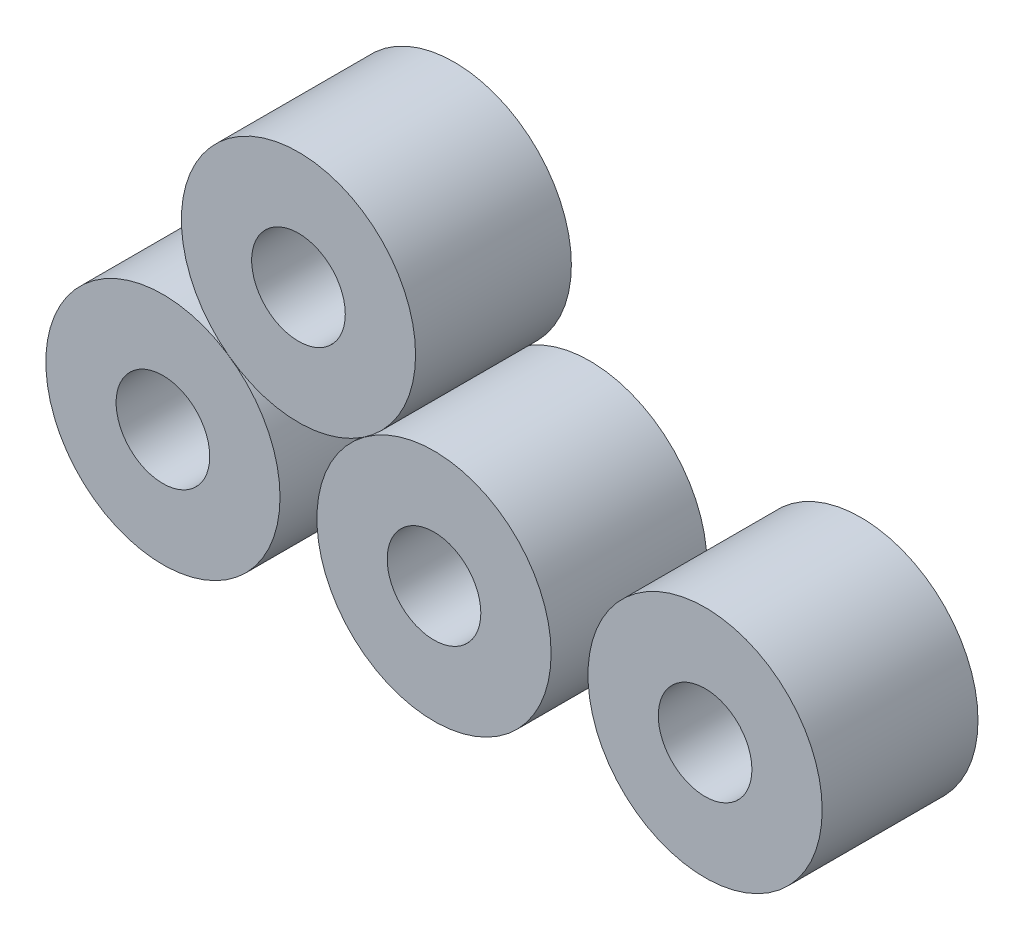
ISO-10303-21;
HEADER;
FILE_DESCRIPTION(('STEP AP214'),'2;1');
FILE_NAME('part.step','',(''),(''),'','','');
FILE_SCHEMA(('AUTOMOTIVE_DESIGN { 1 0 10303 214 1 1 1 1 }'));
ENDSEC;
DATA;
#1=APPLICATION_CONTEXT('core data for automotive mechanical design processes');
#2=APPLICATION_PROTOCOL_DEFINITION('international standard','automotive_design',2000,#1);
#3=PRODUCT_CONTEXT('',#1,'mechanical');
#4=PRODUCT('Part','Part','',(#3));
#5=PRODUCT_RELATED_PRODUCT_CATEGORY('part','',(#4));
#6=PRODUCT_DEFINITION_FORMATION('','',#4);
#7=PRODUCT_DEFINITION_CONTEXT('part definition',#1,'design');
#8=PRODUCT_DEFINITION('design','',#6,#7);
#9=PRODUCT_DEFINITION_SHAPE('','',#8);
#10=(LENGTH_UNIT() NAMED_UNIT(*) SI_UNIT(.MILLI.,.METRE.));
#11=(NAMED_UNIT(*) PLANE_ANGLE_UNIT() SI_UNIT($,.RADIAN.));
#12=(NAMED_UNIT(*) SI_UNIT($,.STERADIAN.) SOLID_ANGLE_UNIT());
#13=UNCERTAINTY_MEASURE_WITH_UNIT(LENGTH_MEASURE(1.E-05),#10,'distance_accuracy_value','');
#14=(GEOMETRIC_REPRESENTATION_CONTEXT(3) GLOBAL_UNCERTAINTY_ASSIGNED_CONTEXT((#13)) GLOBAL_UNIT_ASSIGNED_CONTEXT((#10,
#11,#12)) REPRESENTATION_CONTEXT('',''));
#15=CARTESIAN_POINT('',(0.,0.,0.));
#16=DIRECTION('',(0.,0.,1.));
#17=DIRECTION('',(1.,0.,0.));
#18=AXIS2_PLACEMENT_3D('',#15,#16,#17);
#19=CARTESIAN_POINT('',(0.,0.,1268.));
#20=DIRECTION('',(0.,0.,1.));
#21=DIRECTION('',(1.,0.,0.));
#22=AXIS2_PLACEMENT_3D('',#19,#20,#21);
#23=PLANE('',#22);
#24=CARTESIAN_POINT('',(0.,0.,1268.));
#25=DIRECTION('',(0.,0.,1.));
#26=DIRECTION('',(1.,0.,0.));
#27=AXIS2_PLACEMENT_3D('',#24,#25,#26);
#28=CIRCLE('',#27,953.);
#29=CARTESIAN_POINT('',(953.,0.,1268.));
#30=VERTEX_POINT('',#29);
#31=EDGE_CURVE('E97',#30,#30,#28,.T.);
#32=ORIENTED_EDGE('',*,*,#31,.T.);
#33=EDGE_LOOP('',(#32));
#34=FACE_BOUND('',#33,.T.);
#35=CARTESIAN_POINT('',(0.,0.,1268.));
#36=DIRECTION('',(0.,0.,1.));
#37=DIRECTION('',(1.,0.,0.));
#38=AXIS2_PLACEMENT_3D('',#35,#36,#37);
#39=CIRCLE('',#38,381.);
#40=CARTESIAN_POINT('',(381.,0.,1268.));
#41=VERTEX_POINT('',#40);
#42=EDGE_CURVE('E88',#41,#41,#39,.T.);
#43=ORIENTED_EDGE('',*,*,#42,.F.);
#44=EDGE_LOOP('',(#43));
#45=FACE_BOUND('',#44,.T.);
#46=ADVANCED_FACE('F84',(#34,#45),#23,.T.);
#47=CARTESIAN_POINT('',(0.,0.,0.));
#48=DIRECTION('',(0.,0.,1.));
#49=DIRECTION('',(1.,0.,0.));
#50=AXIS2_PLACEMENT_3D('',#47,#48,#49);
#51=PLANE('',#50);
#52=CARTESIAN_POINT('',(0.,0.,0.));
#53=DIRECTION('',(0.,0.,1.));
#54=DIRECTION('',(1.,0.,0.));
#55=AXIS2_PLACEMENT_3D('',#52,#53,#54);
#56=CIRCLE('',#55,953.);
#57=CARTESIAN_POINT('',(953.,0.,0.));
#58=VERTEX_POINT('',#57);
#59=EDGE_CURVE('E95',#58,#58,#56,.T.);
#60=ORIENTED_EDGE('',*,*,#59,.F.);
#61=EDGE_LOOP('',(#60));
#62=FACE_BOUND('',#61,.T.);
#63=CARTESIAN_POINT('',(0.,0.,0.));
#64=DIRECTION('',(0.,0.,1.));
#65=DIRECTION('',(1.,0.,0.));
#66=AXIS2_PLACEMENT_3D('',#63,#64,#65);
#67=CIRCLE('',#66,381.);
#68=CARTESIAN_POINT('',(381.,0.,0.));
#69=VERTEX_POINT('',#68);
#70=EDGE_CURVE('E12',#69,#69,#67,.T.);
#71=ORIENTED_EDGE('',*,*,#70,.T.);
#72=EDGE_LOOP('',(#71));
#73=FACE_BOUND('',#72,.T.);
#74=ADVANCED_FACE('F106',(#62,#73),#51,.F.);
#75=CARTESIAN_POINT('',(0.,0.,1268.));
#76=DIRECTION('',(0.,0.,-1.));
#77=DIRECTION('',(-1.,0.,0.));
#78=AXIS2_PLACEMENT_3D('',#75,#76,#77);
#79=CYLINDRICAL_SURFACE('',#78,953.);
#80=ORIENTED_EDGE('',*,*,#59,.T.);
#81=EDGE_LOOP('',(#80));
#82=FACE_BOUND('',#81,.T.);
#83=ORIENTED_EDGE('',*,*,#31,.F.);
#84=EDGE_LOOP('',(#83));
#85=FACE_BOUND('',#84,.T.);
#86=ADVANCED_FACE('F103',(#82,#85),#79,.T.);
#87=CARTESIAN_POINT('',(0.,0.,1268.));
#88=DIRECTION('',(0.,0.,-1.));
#89=DIRECTION('',(-1.,0.,0.));
#90=AXIS2_PLACEMENT_3D('',#87,#88,#89);
#91=CYLINDRICAL_SURFACE('',#90,381.);
#92=ORIENTED_EDGE('',*,*,#42,.T.);
#93=EDGE_LOOP('',(#92));
#94=FACE_BOUND('',#93,.T.);
#95=ORIENTED_EDGE('',*,*,#70,.F.);
#96=EDGE_LOOP('',(#95));
#97=FACE_BOUND('',#96,.T.);
#98=ADVANCED_FACE('F86',(#94,#97),#91,.F.);
#99=CLOSED_SHELL('',(#46,#74,#86,#98));
#100=MANIFOLD_SOLID_BREP('B2',#99);
#101=CARTESIAN_POINT('',(1103.,1554.42175743908,1268.));
#102=DIRECTION('',(0.,0.,-1.));
#103=DIRECTION('',(-1.,0.,0.));
#104=AXIS2_PLACEMENT_3D('',#101,#102,#103);
#105=CYLINDRICAL_SURFACE('',#104,952.999999999999);
#106=CARTESIAN_POINT('',(1103.,1554.42175743908,0.));
#107=DIRECTION('',(0.,0.,1.));
#108=DIRECTION('',(1.,0.,0.));
#109=AXIS2_PLACEMENT_3D('',#106,#107,#108);
#110=CIRCLE('',#109,952.999999999999);
#111=CARTESIAN_POINT('',(2056.,1554.42175743908,0.));
#112=VERTEX_POINT('',#111);
#113=EDGE_CURVE('E169',#112,#112,#110,.T.);
#114=ORIENTED_EDGE('',*,*,#113,.T.);
#115=EDGE_LOOP('',(#114));
#116=FACE_BOUND('',#115,.T.);
#117=CARTESIAN_POINT('',(1103.,1554.42175743908,1268.));
#118=DIRECTION('',(0.,0.,1.));
#119=DIRECTION('',(1.,0.,0.));
#120=AXIS2_PLACEMENT_3D('',#117,#118,#119);
#121=CIRCLE('',#120,952.999999999999);
#122=CARTESIAN_POINT('',(2056.,1554.42175743908,1268.));
#123=VERTEX_POINT('',#122);
#124=EDGE_CURVE('E171',#123,#123,#121,.T.);
#125=ORIENTED_EDGE('',*,*,#124,.F.);
#126=EDGE_LOOP('',(#125));
#127=FACE_BOUND('',#126,.T.);
#128=ADVANCED_FACE('F158',(#116,#127),#105,.T.);
#129=CARTESIAN_POINT('',(1103.,1554.42175743908,1268.));
#130=DIRECTION('',(0.,0.,1.));
#131=DIRECTION('',(1.,0.,0.));
#132=AXIS2_PLACEMENT_3D('',#129,#130,#131);
#133=PLANE('',#132);
#134=ORIENTED_EDGE('',*,*,#124,.T.);
#135=EDGE_LOOP('',(#134));
#136=FACE_BOUND('',#135,.T.);
#137=CARTESIAN_POINT('',(1103.,1554.42175743908,1268.));
#138=DIRECTION('',(0.,0.,1.));
#139=DIRECTION('',(1.,0.,0.));
#140=AXIS2_PLACEMENT_3D('',#137,#138,#139);
#141=CIRCLE('',#140,381.);
#142=CARTESIAN_POINT('',(1484.,1554.42175743908,1268.));
#143=VERTEX_POINT('',#142);
#144=EDGE_CURVE('E162',#143,#143,#141,.T.);
#145=ORIENTED_EDGE('',*,*,#144,.F.);
#146=EDGE_LOOP('',(#145));
#147=FACE_BOUND('',#146,.T.);
#148=ADVANCED_FACE('F181',(#136,#147),#133,.T.);
#149=CARTESIAN_POINT('',(1103.,1554.42175743908,0.));
#150=DIRECTION('',(0.,0.,1.));
#151=DIRECTION('',(1.,0.,0.));
#152=AXIS2_PLACEMENT_3D('',#149,#150,#151);
#153=PLANE('',#152);
#154=ORIENTED_EDGE('',*,*,#113,.F.);
#155=EDGE_LOOP('',(#154));
#156=FACE_BOUND('',#155,.T.);
#157=CARTESIAN_POINT('',(1103.,1554.42175743908,0.));
#158=DIRECTION('',(0.,0.,1.));
#159=DIRECTION('',(1.,0.,0.));
#160=AXIS2_PLACEMENT_3D('',#157,#158,#159);
#161=CIRCLE('',#160,381.);
#162=CARTESIAN_POINT('',(1484.,1554.42175743908,0.));
#163=VERTEX_POINT('',#162);
#164=EDGE_CURVE('E83',#163,#163,#161,.T.);
#165=ORIENTED_EDGE('',*,*,#164,.T.);
#166=EDGE_LOOP('',(#165));
#167=FACE_BOUND('',#166,.T.);
#168=ADVANCED_FACE('F179',(#156,#167),#153,.F.);
#169=CARTESIAN_POINT('',(1103.,1554.42175743908,1268.));
#170=DIRECTION('',(0.,0.,-1.));
#171=DIRECTION('',(-1.,0.,0.));
#172=AXIS2_PLACEMENT_3D('',#169,#170,#171);
#173=CYLINDRICAL_SURFACE('',#172,381.);
#174=ORIENTED_EDGE('',*,*,#144,.T.);
#175=EDGE_LOOP('',(#174));
#176=FACE_BOUND('',#175,.T.);
#177=ORIENTED_EDGE('',*,*,#164,.F.);
#178=EDGE_LOOP('',(#177));
#179=FACE_BOUND('',#178,.T.);
#180=ADVANCED_FACE('F160',(#176,#179),#173,.F.);
#181=CLOSED_SHELL('',(#128,#148,#168,#180));
#182=MANIFOLD_SOLID_BREP('B7',#181);
#183=CARTESIAN_POINT('',(4412.,0.,1268.));
#184=DIRECTION('',(0.,0.,1.));
#185=DIRECTION('',(1.,0.,0.));
#186=AXIS2_PLACEMENT_3D('',#183,#184,#185);
#187=PLANE('',#186);
#188=CARTESIAN_POINT('',(4412.,0.,1268.));
#189=DIRECTION('',(0.,0.,1.));
#190=DIRECTION('',(1.,0.,0.));
#191=AXIS2_PLACEMENT_3D('',#188,#189,#190);
#192=CIRCLE('',#191,953.);
#193=CARTESIAN_POINT('',(5365.,0.,1268.));
#194=VERTEX_POINT('',#193);
#195=EDGE_CURVE('E244',#194,#194,#192,.T.);
#196=ORIENTED_EDGE('',*,*,#195,.T.);
#197=EDGE_LOOP('',(#196));
#198=FACE_BOUND('',#197,.T.);
#199=CARTESIAN_POINT('',(4412.,0.,1268.));
#200=DIRECTION('',(0.,0.,1.));
#201=DIRECTION('',(1.,0.,0.));
#202=AXIS2_PLACEMENT_3D('',#199,#200,#201);
#203=CIRCLE('',#202,381.);
#204=CARTESIAN_POINT('',(4793.,0.,1268.));
#205=VERTEX_POINT('',#204);
#206=EDGE_CURVE('E235',#205,#205,#203,.T.);
#207=ORIENTED_EDGE('',*,*,#206,.F.);
#208=EDGE_LOOP('',(#207));
#209=FACE_BOUND('',#208,.T.);
#210=ADVANCED_FACE('F231',(#198,#209),#187,.T.);
#211=CARTESIAN_POINT('',(4412.,0.,0.));
#212=DIRECTION('',(0.,0.,1.));
#213=DIRECTION('',(1.,0.,0.));
#214=AXIS2_PLACEMENT_3D('',#211,#212,#213);
#215=PLANE('',#214);
#216=CARTESIAN_POINT('',(4412.,0.,0.));
#217=DIRECTION('',(0.,0.,1.));
#218=DIRECTION('',(1.,0.,0.));
#219=AXIS2_PLACEMENT_3D('',#216,#217,#218);
#220=CIRCLE('',#219,953.);
#221=CARTESIAN_POINT('',(5365.,0.,0.));
#222=VERTEX_POINT('',#221);
#223=EDGE_CURVE('E242',#222,#222,#220,.T.);
#224=ORIENTED_EDGE('',*,*,#223,.F.);
#225=EDGE_LOOP('',(#224));
#226=FACE_BOUND('',#225,.T.);
#227=CARTESIAN_POINT('',(4412.,0.,0.));
#228=DIRECTION('',(0.,0.,1.));
#229=DIRECTION('',(1.,0.,0.));
#230=AXIS2_PLACEMENT_3D('',#227,#228,#229);
#231=CIRCLE('',#230,381.);
#232=CARTESIAN_POINT('',(4793.,0.,0.));
#233=VERTEX_POINT('',#232);
#234=EDGE_CURVE('E157',#233,#233,#231,.T.);
#235=ORIENTED_EDGE('',*,*,#234,.T.);
#236=EDGE_LOOP('',(#235));
#237=FACE_BOUND('',#236,.T.);
#238=ADVANCED_FACE('F252',(#226,#237),#215,.F.);
#239=CARTESIAN_POINT('',(4412.,0.,1268.));
#240=DIRECTION('',(0.,0.,-1.));
#241=DIRECTION('',(-1.,0.,0.));
#242=AXIS2_PLACEMENT_3D('',#239,#240,#241);
#243=CYLINDRICAL_SURFACE('',#242,953.);
#244=ORIENTED_EDGE('',*,*,#195,.F.);
#245=EDGE_LOOP('',(#244));
#246=FACE_BOUND('',#245,.T.);
#247=ORIENTED_EDGE('',*,*,#223,.T.);
#248=EDGE_LOOP('',(#247));
#249=FACE_BOUND('',#248,.T.);
#250=ADVANCED_FACE('F250',(#246,#249),#243,.T.);
#251=CARTESIAN_POINT('',(4412.,0.,1268.));
#252=DIRECTION('',(0.,0.,-1.));
#253=DIRECTION('',(-1.,0.,0.));
#254=AXIS2_PLACEMENT_3D('',#251,#252,#253);
#255=CYLINDRICAL_SURFACE('',#254,381.);
#256=ORIENTED_EDGE('',*,*,#206,.T.);
#257=EDGE_LOOP('',(#256));
#258=FACE_BOUND('',#257,.T.);
#259=ORIENTED_EDGE('',*,*,#234,.F.);
#260=EDGE_LOOP('',(#259));
#261=FACE_BOUND('',#260,.T.);
#262=ADVANCED_FACE('F233',(#258,#261),#255,.F.);
#263=CLOSED_SHELL('',(#210,#238,#250,#262));
#264=MANIFOLD_SOLID_BREP('B78',#263);
#265=CARTESIAN_POINT('',(2206.,0.,1268.));
#266=DIRECTION('',(0.,0.,1.));
#267=DIRECTION('',(1.,0.,0.));
#268=AXIS2_PLACEMENT_3D('',#265,#266,#267);
#269=PLANE('',#268);
#270=CARTESIAN_POINT('',(2206.,0.,1268.));
#271=DIRECTION('',(0.,0.,1.));
#272=DIRECTION('',(1.,0.,0.));
#273=AXIS2_PLACEMENT_3D('',#270,#271,#272);
#274=CIRCLE('',#273,953.);
#275=CARTESIAN_POINT('',(3159.,0.,1268.));
#276=VERTEX_POINT('',#275);
#277=EDGE_CURVE('E230',#276,#276,#274,.T.);
#278=ORIENTED_EDGE('',*,*,#277,.T.);
#279=EDGE_LOOP('',(#278));
#280=FACE_BOUND('',#279,.T.);
#281=CARTESIAN_POINT('',(2206.,0.,1268.));
#282=DIRECTION('',(0.,0.,1.));
#283=DIRECTION('',(1.,0.,0.));
#284=AXIS2_PLACEMENT_3D('',#281,#282,#283);
#285=CIRCLE('',#284,381.);
#286=CARTESIAN_POINT('',(2587.,0.,1268.));
#287=VERTEX_POINT('',#286);
#288=EDGE_CURVE('E308',#287,#287,#285,.T.);
#289=ORIENTED_EDGE('',*,*,#288,.F.);
#290=EDGE_LOOP('',(#289));
#291=FACE_BOUND('',#290,.T.);
#292=ADVANCED_FACE('F297',(#280,#291),#269,.T.);
#293=CARTESIAN_POINT('',(2206.,0.,0.));
#294=DIRECTION('',(0.,0.,1.));
#295=DIRECTION('',(1.,0.,0.));
#296=AXIS2_PLACEMENT_3D('',#293,#294,#295);
#297=PLANE('',#296);
#298=CARTESIAN_POINT('',(2206.,0.,0.));
#299=DIRECTION('',(0.,0.,1.));
#300=DIRECTION('',(1.,0.,0.));
#301=AXIS2_PLACEMENT_3D('',#298,#299,#300);
#302=CIRCLE('',#301,953.);
#303=CARTESIAN_POINT('',(3159.,0.,0.));
#304=VERTEX_POINT('',#303);
#305=EDGE_CURVE('E301',#304,#304,#302,.T.);
#306=ORIENTED_EDGE('',*,*,#305,.F.);
#307=EDGE_LOOP('',(#306));
#308=FACE_BOUND('',#307,.T.);
#309=CARTESIAN_POINT('',(2206.,0.,0.));
#310=DIRECTION('',(0.,0.,1.));
#311=DIRECTION('',(1.,0.,0.));
#312=AXIS2_PLACEMENT_3D('',#309,#310,#311);
#313=CIRCLE('',#312,381.);
#314=CARTESIAN_POINT('',(2587.,0.,0.));
#315=VERTEX_POINT('',#314);
#316=EDGE_CURVE('E310',#315,#315,#313,.T.);
#317=ORIENTED_EDGE('',*,*,#316,.T.);
#318=EDGE_LOOP('',(#317));
#319=FACE_BOUND('',#318,.T.);
#320=ADVANCED_FACE('F320',(#308,#319),#297,.F.);
#321=CARTESIAN_POINT('',(2206.,0.,1268.));
#322=DIRECTION('',(0.,0.,-1.));
#323=DIRECTION('',(-1.,0.,0.));
#324=AXIS2_PLACEMENT_3D('',#321,#322,#323);
#325=CYLINDRICAL_SURFACE('',#324,953.);
#326=ORIENTED_EDGE('',*,*,#305,.T.);
#327=EDGE_LOOP('',(#326));
#328=FACE_BOUND('',#327,.T.);
#329=ORIENTED_EDGE('',*,*,#277,.F.);
#330=EDGE_LOOP('',(#329));
#331=FACE_BOUND('',#330,.T.);
#332=ADVANCED_FACE('F299',(#328,#331),#325,.T.);
#333=CARTESIAN_POINT('',(2206.,0.,1268.));
#334=DIRECTION('',(0.,0.,-1.));
#335=DIRECTION('',(-1.,0.,0.));
#336=AXIS2_PLACEMENT_3D('',#333,#334,#335);
#337=CYLINDRICAL_SURFACE('',#336,381.);
#338=ORIENTED_EDGE('',*,*,#288,.T.);
#339=EDGE_LOOP('',(#338));
#340=FACE_BOUND('',#339,.T.);
#341=ORIENTED_EDGE('',*,*,#316,.F.);
#342=EDGE_LOOP('',(#341));
#343=FACE_BOUND('',#342,.T.);
#344=ADVANCED_FACE('F316',(#340,#343),#337,.F.);
#345=CLOSED_SHELL('',(#292,#320,#332,#344));
#346=MANIFOLD_SOLID_BREP('B152',#345);
#347=ADVANCED_BREP_SHAPE_REPRESENTATION('',(#18,#100,#182,#264,#346),#14);
#348=SHAPE_DEFINITION_REPRESENTATION(#9,#347);
ENDSEC;
END-ISO-10303-21;
